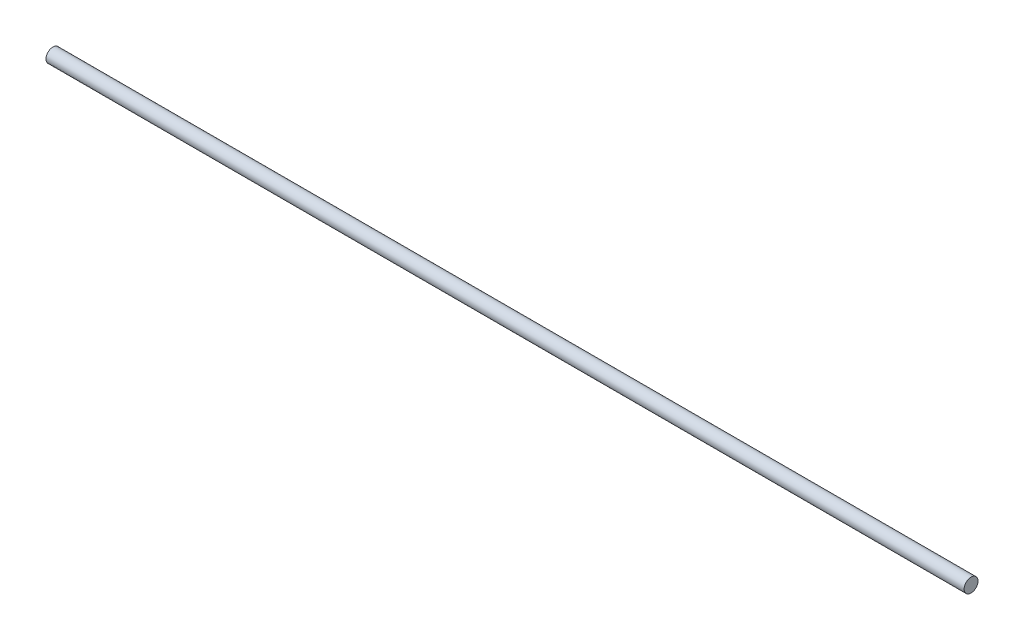
ISO-10303-21;
HEADER;
FILE_DESCRIPTION(('STEP AP214'),'2;1');
FILE_NAME('part.step','',(''),(''),'','','');
FILE_SCHEMA(('AUTOMOTIVE_DESIGN { 1 0 10303 214 1 1 1 1 }'));
ENDSEC;
DATA;
#1=APPLICATION_CONTEXT('core data for automotive mechanical design processes');
#2=APPLICATION_PROTOCOL_DEFINITION('international standard','automotive_design',2000,#1);
#3=PRODUCT_CONTEXT('',#1,'mechanical');
#4=PRODUCT('Part','Part','',(#3));
#5=PRODUCT_RELATED_PRODUCT_CATEGORY('part','',(#4));
#6=PRODUCT_DEFINITION_FORMATION('','',#4);
#7=PRODUCT_DEFINITION_CONTEXT('part definition',#1,'design');
#8=PRODUCT_DEFINITION('design','',#6,#7);
#9=PRODUCT_DEFINITION_SHAPE('','',#8);
#10=(LENGTH_UNIT() NAMED_UNIT(*) SI_UNIT(.MILLI.,.METRE.));
#11=(NAMED_UNIT(*) PLANE_ANGLE_UNIT() SI_UNIT($,.RADIAN.));
#12=(NAMED_UNIT(*) SI_UNIT($,.STERADIAN.) SOLID_ANGLE_UNIT());
#13=UNCERTAINTY_MEASURE_WITH_UNIT(LENGTH_MEASURE(1.E-05),#10,'distance_accuracy_value','');
#14=(GEOMETRIC_REPRESENTATION_CONTEXT(3) GLOBAL_UNCERTAINTY_ASSIGNED_CONTEXT((#13)) GLOBAL_UNIT_ASSIGNED_CONTEXT((#10,
#11,#12)) REPRESENTATION_CONTEXT('',''));
#15=CARTESIAN_POINT('',(0.,0.,0.));
#16=DIRECTION('',(0.,0.,1.));
#17=DIRECTION('',(1.,0.,0.));
#18=AXIS2_PLACEMENT_3D('',#15,#16,#17);
#19=CARTESIAN_POINT('',(631.19,0.,0.));
#20=DIRECTION('',(-1.,0.,0.));
#21=DIRECTION('',(0.,0.,1.));
#22=AXIS2_PLACEMENT_3D('',#19,#20,#21);
#23=CYLINDRICAL_SURFACE('',#22,4.7625);
#24=CARTESIAN_POINT('',(631.19,0.,0.));
#25=DIRECTION('',(1.,0.,0.));
#26=DIRECTION('',(0.,0.,-1.));
#27=AXIS2_PLACEMENT_3D('',#24,#25,#26);
#28=CIRCLE('',#27,4.7625);
#29=CARTESIAN_POINT('',(631.19,0.,-4.7625));
#30=VERTEX_POINT('',#29);
#31=EDGE_CURVE('E11',#30,#30,#28,.T.);
#32=ORIENTED_EDGE('',*,*,#31,.F.);
#33=EDGE_LOOP('',(#32));
#34=FACE_BOUND('',#33,.T.);
#35=CARTESIAN_POINT('',(0.,0.,0.));
#36=DIRECTION('',(1.,0.,0.));
#37=DIRECTION('',(0.,0.,-1.));
#38=AXIS2_PLACEMENT_3D('',#35,#36,#37);
#39=CIRCLE('',#38,4.7625);
#40=CARTESIAN_POINT('',(0.,0.,-4.7625));
#41=VERTEX_POINT('',#40);
#42=EDGE_CURVE('E50',#41,#41,#39,.T.);
#43=ORIENTED_EDGE('',*,*,#42,.T.);
#44=EDGE_LOOP('',(#43));
#45=FACE_BOUND('',#44,.T.);
#46=ADVANCED_FACE('F47',(#34,#45),#23,.T.);
#47=CARTESIAN_POINT('',(631.19,0.,0.));
#48=DIRECTION('',(1.,0.,0.));
#49=DIRECTION('',(0.,0.,-1.));
#50=AXIS2_PLACEMENT_3D('',#47,#48,#49);
#51=PLANE('',#50);
#52=ORIENTED_EDGE('',*,*,#31,.T.);
#53=EDGE_LOOP('',(#52));
#54=FACE_BOUND('',#53,.T.);
#55=ADVANCED_FACE('F66',(#54),#51,.T.);
#56=CARTESIAN_POINT('',(0.,0.,0.));
#57=DIRECTION('',(1.,0.,0.));
#58=DIRECTION('',(0.,0.,-1.));
#59=AXIS2_PLACEMENT_3D('',#56,#57,#58);
#60=PLANE('',#59);
#61=ORIENTED_EDGE('',*,*,#42,.F.);
#62=EDGE_LOOP('',(#61));
#63=FACE_BOUND('',#62,.T.);
#64=ADVANCED_FACE('F64',(#63),#60,.F.);
#65=CLOSED_SHELL('',(#46,#55,#64));
#66=MANIFOLD_SOLID_BREP('B2',#65);
#67=ADVANCED_BREP_SHAPE_REPRESENTATION('',(#18,#66),#14);
#68=SHAPE_DEFINITION_REPRESENTATION(#9,#67);
ENDSEC;
END-ISO-10303-21;
